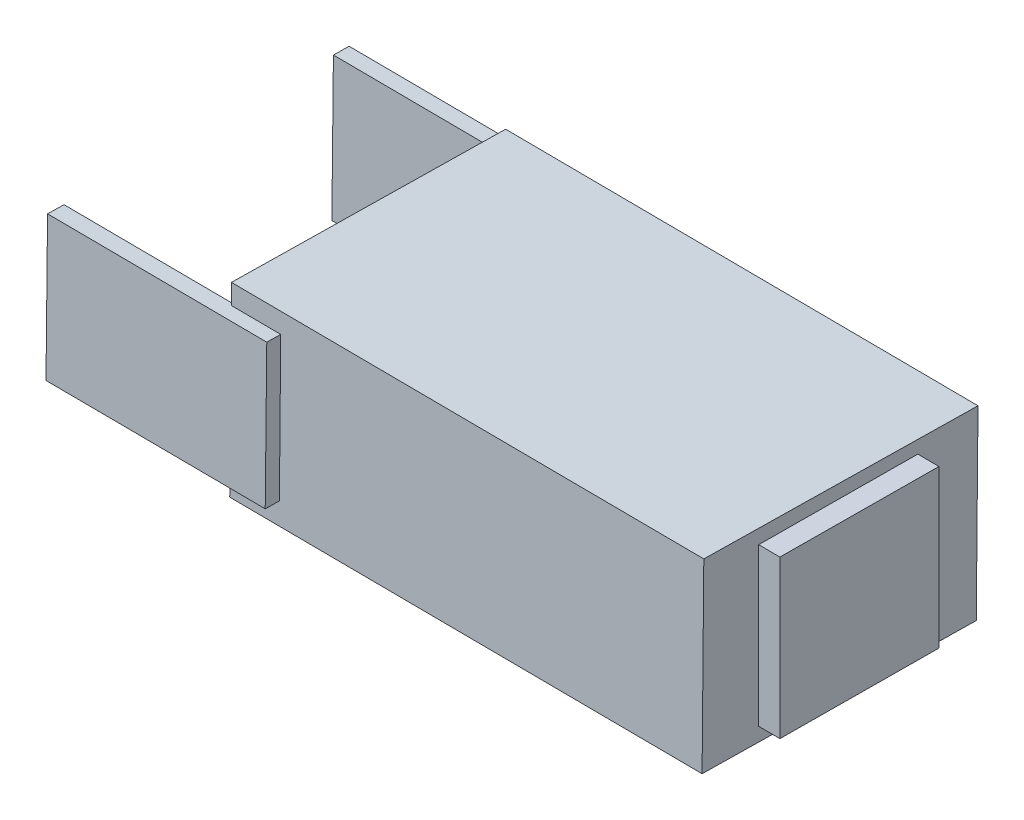
ISO-10303-21;
HEADER;
FILE_DESCRIPTION(('STEP AP214'),'2;1');
FILE_NAME('part.step','',(''),(''),'','','');
FILE_SCHEMA(('AUTOMOTIVE_DESIGN { 1 0 10303 214 1 1 1 1 }'));
ENDSEC;
DATA;
#1=APPLICATION_CONTEXT('core data for automotive mechanical design processes');
#2=APPLICATION_PROTOCOL_DEFINITION('international standard','automotive_design',2000,#1);
#3=PRODUCT_CONTEXT('',#1,'mechanical');
#4=PRODUCT('Part','Part','',(#3));
#5=PRODUCT_RELATED_PRODUCT_CATEGORY('part','',(#4));
#6=PRODUCT_DEFINITION_FORMATION('','',#4);
#7=PRODUCT_DEFINITION_CONTEXT('part definition',#1,'design');
#8=PRODUCT_DEFINITION('design','',#6,#7);
#9=PRODUCT_DEFINITION_SHAPE('','',#8);
#10=(LENGTH_UNIT() NAMED_UNIT(*) SI_UNIT(.MILLI.,.METRE.));
#11=(NAMED_UNIT(*) PLANE_ANGLE_UNIT() SI_UNIT($,.RADIAN.));
#12=(NAMED_UNIT(*) SI_UNIT($,.STERADIAN.) SOLID_ANGLE_UNIT());
#13=UNCERTAINTY_MEASURE_WITH_UNIT(LENGTH_MEASURE(1.E-05),#10,'distance_accuracy_value','');
#14=(GEOMETRIC_REPRESENTATION_CONTEXT(3) GLOBAL_UNCERTAINTY_ASSIGNED_CONTEXT((#13)) GLOBAL_UNIT_ASSIGNED_CONTEXT((#10,
#11,#12)) REPRESENTATION_CONTEXT('',''));
#15=CARTESIAN_POINT('',(0.,0.,0.));
#16=DIRECTION('',(0.,0.,1.));
#17=DIRECTION('',(1.,0.,0.));
#18=AXIS2_PLACEMENT_3D('',#15,#16,#17);
#19=CARTESIAN_POINT('',(270.257448038928,0.0207505591907991,1.91307762517656));
#20=DIRECTION('',(-0.999974943834145,-7.67787878256531E-05,-0.00707854567808517));
#21=DIRECTION('',(-0.00707854569894912,0.,0.999974946781562));
#22=AXIS2_PLACEMENT_3D('',#19,#20,#21);
#23=PLANE('',#22);
#24=DIRECTION('',(1.09657575421331E-05,-0.999956780919569,0.0092971056100546));
#25=VECTOR('',#24,1.);
#26=CARTESIAN_POINT('',(273.771254421079,-237.001225716183,-491.905884429451));
#27=LINE('',#26,#25);
#28=CARTESIAN_POINT('',(273.771254421079,-237.001225716183,-491.905884429451));
#29=VERTEX_POINT('',#28);
#30=CARTESIAN_POINT('',(273.771540444246,-263.083400614204,-491.663385214291));
#31=VERTEX_POINT('',#30);
#32=EDGE_CURVE('E306',#29,#31,#27,.T.);
#33=ORIENTED_EDGE('',*,*,#32,.F.);
#34=DIRECTION('',(0.00707895357034994,-0.00929679503861884,-0.999931726678556));
#35=VECTOR('',#34,1.);
#36=CARTESIAN_POINT('',(273.771254421079,-237.001225716183,-491.905884429451));
#37=LINE('',#36,#35);
#38=CARTESIAN_POINT('',(273.49979153482,-236.644713303854,-453.560619145846));
#39=VERTEX_POINT('',#38);
#40=EDGE_CURVE('E316',#39,#29,#37,.T.);
#41=ORIENTED_EDGE('',*,*,#40,.F.);
#42=DIRECTION('',(-1.09657575431972E-05,0.999956780919569,-0.00929710561005673));
#43=VECTOR('',#42,1.);
#44=CARTESIAN_POINT('',(273.49979153482,-236.644713303854,-453.560619145846));
#45=LINE('',#44,#43);
#46=CARTESIAN_POINT('',(273.500077557988,-262.726888201874,-453.318119930686));
#47=VERTEX_POINT('',#46);
#48=EDGE_CURVE('E313',#47,#39,#45,.T.);
#49=ORIENTED_EDGE('',*,*,#48,.F.);
#50=DIRECTION('',(-0.00707895357034921,0.00929679503861956,0.999931726678556));
#51=VECTOR('',#50,1.);
#52=CARTESIAN_POINT('',(273.771540444246,-263.083400614204,-491.663385214291));
#53=LINE('',#52,#51);
#54=EDGE_CURVE('E309',#31,#47,#53,.T.);
#55=ORIENTED_EDGE('',*,*,#54,.F.);
#56=EDGE_LOOP('',(#33,#41,#49,#55));
#57=FACE_BOUND('',#56,.T.);
#58=DIRECTION('',(7.67807114300989E-05,-0.999999997052361,0.));
#59=VECTOR('',#58,1.);
#60=CARTESIAN_POINT('',(273.535986913891,0.0210022877388938,-461.240922613393));
#61=LINE('',#60,#59);
#62=CARTESIAN_POINT('',(273.554317622219,-238.720055625253,-461.240922613393));
#63=VERTEX_POINT('',#62);
#64=CARTESIAN_POINT('',(273.55601837581,-260.870847851427,-461.240922613393));
#65=VERTEX_POINT('',#64);
#66=EDGE_CURVE('E443',#63,#65,#61,.T.);
#67=ORIENTED_EDGE('',*,*,#66,.F.);
#68=DIRECTION('',(-0.00707854565722093,-5.43495773381844E-07,0.99997494678171));
#69=VECTOR('',#68,1.);
#70=CARTESIAN_POINT('',(270.275778747256,-238.720307353801,1.91307762517668));
#71=LINE('',#70,#69);
#72=CARTESIAN_POINT('',(273.711807606152,-238.72004353306,-483.489283495451));
#73=VERTEX_POINT('',#72);
#74=EDGE_CURVE('E207',#73,#63,#71,.T.);
#75=ORIENTED_EDGE('',*,*,#74,.F.);
#76=DIRECTION('',(7.67807114300988E-05,-0.999999997052361,0.));
#77=VECTOR('',#76,1.);
#78=CARTESIAN_POINT('',(273.693476897824,0.0210143799319305,-483.489283495451));
#79=LINE('',#78,#77);
#80=CARTESIAN_POINT('',(273.713508359743,-260.870835759234,-483.489283495451));
#81=VERTEX_POINT('',#80);
#82=EDGE_CURVE('E203',#73,#81,#79,.T.);
#83=ORIENTED_EDGE('',*,*,#82,.T.);
#84=DIRECTION('',(-0.00707854565722093,-5.43495772134533E-07,0.99997494678171));
#85=VECTOR('',#84,1.);
#86=CARTESIAN_POINT('',(270.277479500847,-260.871099579975,1.913077625177));
#87=LINE('',#86,#85);
#88=EDGE_CURVE('E59',#81,#65,#87,.T.);
#89=ORIENTED_EDGE('',*,*,#88,.T.);
#90=EDGE_LOOP('',(#67,#75,#83,#89));
#91=FACE_BOUND('',#90,.T.);
#92=ADVANCED_FACE('F43',(#57,#91),#23,.F.);
#93=CARTESIAN_POINT('',(203.259126802041,0.0156063804064122,1.43881506474485));
#94=DIRECTION('',(-0.999974943834145,-7.67787878256531E-05,-0.00707854567808517));
#95=DIRECTION('',(-0.00707854569894912,0.,0.999974946781562));
#96=AXIS2_PLACEMENT_3D('',#93,#94,#95);
#97=PLANE('',#96);
#98=DIRECTION('',(-1.09657575431972E-05,0.999956780919569,-0.00929710561005673));
#99=VECTOR('',#98,1.);
#100=CARTESIAN_POINT('',(206.501470297933,-236.649857482638,-454.034881706277));
#101=LINE('',#100,#99);
#102=CARTESIAN_POINT('',(206.5017563211,-262.732032380659,-453.792382491117));
#103=VERTEX_POINT('',#102);
#104=CARTESIAN_POINT('',(206.501722750691,-259.670779310986,-453.820844514308));
#105=VERTEX_POINT('',#104);
#106=EDGE_CURVE('E329',#103,#105,#101,.T.);
#107=ORIENTED_EDGE('',*,*,#106,.T.);
#108=DIRECTION('',(0.00707896206367842,-0.0108457798395198,-0.999916125160393));
#109=VECTOR('',#108,1.);
#110=CARTESIAN_POINT('',(203.259126802043,-254.702751307559,4.20166602699391));
#111=LINE('',#110,#109);
#112=CARTESIAN_POINT('',(206.503965959169,-259.674216163038,-454.137701746992));
#113=VERTEX_POINT('',#112);
#114=EDGE_CURVE('E257',#105,#113,#111,.T.);
#115=ORIENTED_EDGE('',*,*,#114,.T.);
#116=DIRECTION('',(0.,0.99994117985244,-0.0108460515999868));
#117=VECTOR('',#116,1.);
#118=CARTESIAN_POINT('',(206.503965959167,-4.95585847507191,-456.900552709241));
#119=LINE('',#118,#117);
#120=CARTESIAN_POINT('',(206.503965959169,-239.456518158962,-454.356996841747));
#121=VERTEX_POINT('',#120);
#122=EDGE_CURVE('E11',#113,#121,#119,.T.);
#123=ORIENTED_EDGE('',*,*,#122,.T.);
#124=DIRECTION('',(-0.00707896206367842,0.0108457798395198,0.999916125160393));
#125=VECTOR('',#124,1.);
#126=CARTESIAN_POINT('',(203.259126802043,-234.485053303483,3.9823709322389));
#127=LINE('',#126,#125);
#128=CARTESIAN_POINT('',(206.501501035009,-239.452741613118,-454.008821870221));
#129=VERTEX_POINT('',#128);
#130=EDGE_CURVE('E254',#121,#129,#127,.T.);
#131=ORIENTED_EDGE('',*,*,#130,.T.);
#132=CARTESIAN_POINT('',(206.501470297933,-236.649857482638,-454.034881706277));
#133=VERTEX_POINT('',#132);
#134=EDGE_CURVE('E328',#129,#133,#101,.T.);
#135=ORIENTED_EDGE('',*,*,#134,.T.);
#136=DIRECTION('',(0.00707895357034994,-0.00929679503861884,-0.999931726678556));
#137=VECTOR('',#136,1.);
#138=CARTESIAN_POINT('',(206.772933184191,-237.006369894968,-492.380146989883));
#139=LINE('',#138,#137);
#140=CARTESIAN_POINT('',(206.772933184191,-237.006369894968,-492.380146989883));
#141=VERTEX_POINT('',#140);
#142=EDGE_CURVE('E333',#133,#141,#139,.T.);
#143=ORIENTED_EDGE('',*,*,#142,.T.);
#144=DIRECTION('',(1.09657575421331E-05,-0.999956780919569,0.0092971056100546));
#145=VECTOR('',#144,1.);
#146=CARTESIAN_POINT('',(206.772933184191,-237.006369894968,-492.380146989883));
#147=LINE('',#146,#145);
#148=CARTESIAN_POINT('',(206.772965256087,-239.930974921039,-492.352955452895));
#149=VERTEX_POINT('',#148);
#150=EDGE_CURVE('E321',#141,#149,#147,.T.);
#151=ORIENTED_EDGE('',*,*,#150,.T.);
#152=DIRECTION('',(-0.00707896206367842,0.0108457798395198,0.999916125160393));
#153=VECTOR('',#152,1.);
#154=CARTESIAN_POINT('',(203.259126802043,-234.547372364424,3.98304688774933));
#155=LINE('',#154,#153);
#156=CARTESIAN_POINT('',(206.77084282897,-239.927723119853,-492.053158804784));
#157=VERTEX_POINT('',#156);
#158=EDGE_CURVE('E303',#149,#157,#155,.T.);
#159=ORIENTED_EDGE('',*,*,#158,.T.);
#160=DIRECTION('',(0.,-0.99994117985244,0.0108460515999871));
#161=VECTOR('',#160,1.);
#162=CARTESIAN_POINT('',(206.770842828968,-5.36474437502192,-494.597390627788));
#163=LINE('',#162,#161);
#164=CARTESIAN_POINT('',(206.77084282897,-260.007107389949,-491.835363956169));
#165=VERTEX_POINT('',#164);
#166=EDGE_CURVE('E362',#157,#165,#163,.T.);
#167=ORIENTED_EDGE('',*,*,#166,.T.);
#168=DIRECTION('',(0.00707896206367842,-0.0108457798395198,-0.999916125160393));
#169=VECTOR('',#168,1.);
#170=CARTESIAN_POINT('',(203.259126802043,-254.62675663452,4.20084173636391));
#171=LINE('',#170,#169);
#172=CARTESIAN_POINT('',(206.773185454963,-260.010696561007,-492.166264091558));
#173=VERTEX_POINT('',#172);
#174=EDGE_CURVE('E299',#165,#173,#171,.T.);
#175=ORIENTED_EDGE('',*,*,#174,.T.);
#176=CARTESIAN_POINT('',(206.773219207359,-263.088544792989,-492.137647774723));
#177=VERTEX_POINT('',#176);
#178=EDGE_CURVE('E320',#173,#177,#147,.T.);
#179=ORIENTED_EDGE('',*,*,#178,.T.);
#180=DIRECTION('',(-0.00707895357034921,0.00929679503861956,0.999931726678556));
#181=VECTOR('',#180,1.);
#182=CARTESIAN_POINT('',(206.773219207359,-263.088544792989,-492.137647774723));
#183=LINE('',#182,#181);
#184=EDGE_CURVE('E325',#177,#103,#183,.T.);
#185=ORIENTED_EDGE('',*,*,#184,.T.);
#186=EDGE_LOOP('',(#107,#115,#123,#131,#135,#143,#151,#159,#167,#175,#179,#185));
#187=FACE_BOUND('',#186,.T.);
#188=ADVANCED_FACE('F399',(#187),#97,.T.);
#189=CARTESIAN_POINT('',(206.501470297933,-236.649857482638,-454.034881706277));
#190=DIRECTION('',(0.00707895357034935,-0.00929679503862093,-0.999931726678556));
#191=DIRECTION('',(0.,0.999956781701404,-0.00929702798593712));
#192=AXIS2_PLACEMENT_3D('',#189,#190,#191);
#193=PLANE('',#192);
#194=ORIENTED_EDGE('',*,*,#48,.T.);
#195=DIRECTION('',(0.999974943834145,7.67787878266708E-05,0.00707854567808531));
#196=VECTOR('',#195,1.);
#197=CARTESIAN_POINT('',(206.501470297933,-236.649857482638,-454.034881706277));
#198=LINE('',#197,#196);
#199=EDGE_CURVE('E339',#133,#39,#198,.T.);
#200=ORIENTED_EDGE('',*,*,#199,.F.);
#201=ORIENTED_EDGE('',*,*,#134,.F.);
#202=DIRECTION('',(-0.999974943834145,-7.67787878176183E-05,-0.00707854567808539));
#203=VECTOR('',#202,1.);
#204=CARTESIAN_POINT('',(206.501501035009,-239.452741613118,-454.008821870221));
#205=LINE('',#204,#203);
#206=CARTESIAN_POINT('',(213.516372606478,-239.452203006287,-453.959165537179));
#207=VERTEX_POINT('',#206);
#208=EDGE_CURVE('E365',#207,#129,#205,.T.);
#209=ORIENTED_EDGE('',*,*,#208,.F.);
#210=DIRECTION('',(-1.09657575334693E-05,0.999956780919569,-0.00929710561005666));
#211=VECTOR('',#210,1.);
#212=CARTESIAN_POINT('',(213.516341869401,-236.649318875807,-453.985225373235));
#213=LINE('',#212,#211);
#214=CARTESIAN_POINT('',(213.516594322159,-259.670240704155,-453.771188181266));
#215=VERTEX_POINT('',#214);
#216=EDGE_CURVE('E369',#215,#207,#213,.T.);
#217=ORIENTED_EDGE('',*,*,#216,.F.);
#218=DIRECTION('',(0.999974943834145,7.67787878158332E-05,0.00707854567808541));
#219=VECTOR('',#218,1.);
#220=CARTESIAN_POINT('',(206.50172275069,-259.670779310986,-453.820844514308));
#221=LINE('',#220,#219);
#222=EDGE_CURVE('E52',#105,#215,#221,.T.);
#223=ORIENTED_EDGE('',*,*,#222,.F.);
#224=ORIENTED_EDGE('',*,*,#106,.F.);
#225=DIRECTION('',(0.999974943834145,7.67787878266708E-05,0.00707854567808531));
#226=VECTOR('',#225,1.);
#227=CARTESIAN_POINT('',(206.5017563211,-262.732032380659,-453.792382491117));
#228=LINE('',#227,#226);
#229=EDGE_CURVE('E343',#103,#47,#228,.T.);
#230=ORIENTED_EDGE('',*,*,#229,.T.);
#231=EDGE_LOOP('',(#194,#200,#201,#209,#217,#223,#224,#230));
#232=FACE_BOUND('',#231,.T.);
#233=ADVANCED_FACE('F404',(#232),#193,.F.);
#234=CARTESIAN_POINT('',(206.772933184191,-237.006369894968,-492.380146989883));
#235=DIRECTION('',(-0.00707895357034935,0.0092967950386188,0.999931726678556));
#236=DIRECTION('',(0.,-0.999956781701404,0.00929702798593499));
#237=AXIS2_PLACEMENT_3D('',#234,#235,#236);
#238=PLANE('',#237);
#239=ORIENTED_EDGE('',*,*,#32,.T.);
#240=DIRECTION('',(0.999974943834145,7.67787878266708E-05,0.00707854567808531));
#241=VECTOR('',#240,1.);
#242=CARTESIAN_POINT('',(206.773219207359,-263.088544792989,-492.137647774723));
#243=LINE('',#242,#241);
#244=EDGE_CURVE('E346',#177,#31,#243,.T.);
#245=ORIENTED_EDGE('',*,*,#244,.F.);
#246=ORIENTED_EDGE('',*,*,#178,.F.);
#247=DIRECTION('',(-0.999974943834145,-7.67787878162537E-05,-0.0070785456780854));
#248=VECTOR('',#247,1.);
#249=CARTESIAN_POINT('',(206.773185454962,-260.010696561007,-492.166264091558));
#250=LINE('',#249,#248);
#251=CARTESIAN_POINT('',(213.914120008543,-260.010148274971,-492.11571539358));
#252=VERTEX_POINT('',#251);
#253=EDGE_CURVE('E350',#252,#173,#250,.T.);
#254=ORIENTED_EDGE('',*,*,#253,.F.);
#255=DIRECTION('',(1.09657575334865E-05,-0.99995678091957,0.00929710561005454));
#256=VECTOR('',#255,1.);
#257=CARTESIAN_POINT('',(213.913867737772,-237.005821608931,-492.329598291905));
#258=LINE('',#257,#256);
#259=CARTESIAN_POINT('',(213.913899809668,-239.930426635003,-492.302406754916));
#260=VERTEX_POINT('',#259);
#261=EDGE_CURVE('E354',#260,#252,#258,.T.);
#262=ORIENTED_EDGE('',*,*,#261,.F.);
#263=DIRECTION('',(0.999974943834145,7.67787878171227E-05,0.00707854567808539));
#264=VECTOR('',#263,1.);
#265=CARTESIAN_POINT('',(206.772965256087,-239.930974921039,-492.352955452895));
#266=LINE('',#265,#264);
#267=EDGE_CURVE('E358',#149,#260,#266,.T.);
#268=ORIENTED_EDGE('',*,*,#267,.F.);
#269=ORIENTED_EDGE('',*,*,#150,.F.);
#270=DIRECTION('',(0.999974943834145,7.67787878266708E-05,0.00707854567808531));
#271=VECTOR('',#270,1.);
#272=CARTESIAN_POINT('',(206.772933184191,-237.006369894968,-492.380146989883));
#273=LINE('',#272,#271);
#274=EDGE_CURVE('E336',#141,#29,#273,.T.);
#275=ORIENTED_EDGE('',*,*,#274,.T.);
#276=EDGE_LOOP('',(#239,#245,#246,#254,#262,#268,#269,#275));
#277=FACE_BOUND('',#276,.T.);
#278=ADVANCED_FACE('F45',(#277),#238,.F.);
#279=CARTESIAN_POINT('',(206.773219207359,-263.088544792989,-492.137647774723));
#280=DIRECTION('',(-1.0965757543144E-05,0.999956780919569,-0.00929710561005536));
#281=DIRECTION('',(0.,0.00929710561061434,0.999956780979691));
#282=AXIS2_PLACEMENT_3D('',#279,#280,#281);
#283=PLANE('',#282);
#284=ORIENTED_EDGE('',*,*,#244,.T.);
#285=ORIENTED_EDGE('',*,*,#54,.T.);
#286=ORIENTED_EDGE('',*,*,#229,.F.);
#287=ORIENTED_EDGE('',*,*,#184,.F.);
#288=EDGE_LOOP('',(#284,#285,#286,#287));
#289=FACE_BOUND('',#288,.T.);
#290=ADVANCED_FACE('F437',(#289),#283,.F.);
#291=CARTESIAN_POINT('',(206.772933184191,-237.006369894968,-492.380146989883));
#292=DIRECTION('',(1.09657575431491E-05,-0.999956780919569,0.00929710561005465));
#293=DIRECTION('',(0.,-0.00929710561061363,-0.999956780979691));
#294=AXIS2_PLACEMENT_3D('',#291,#292,#293);
#295=PLANE('',#294);
#296=ORIENTED_EDGE('',*,*,#199,.T.);
#297=ORIENTED_EDGE('',*,*,#40,.T.);
#298=ORIENTED_EDGE('',*,*,#274,.F.);
#299=ORIENTED_EDGE('',*,*,#142,.F.);
#300=EDGE_LOOP('',(#296,#297,#298,#299));
#301=FACE_BOUND('',#300,.T.);
#302=ADVANCED_FACE('F408',(#301),#295,.F.);
#303=CARTESIAN_POINT('',(213.927351099091,-239.951035549463,-494.202425582158));
#304=DIRECTION('',(-0.999974943834145,-7.67787878170082E-05,-0.00707854567808541));
#305=DIRECTION('',(-0.00707854569894936,0.,0.999974946781562));
#306=AXIS2_PLACEMENT_3D('',#303,#304,#305);
#307=PLANE('',#306);
#308=DIRECTION('',(-0.00707896206367857,0.0108457798395198,0.999916125160393));
#309=VECTOR('',#308,1.);
#310=CARTESIAN_POINT('',(213.927351099091,-239.951035549463,-494.202425582158));
#311=LINE('',#310,#309);
#312=CARTESIAN_POINT('',(213.927351099091,-239.951035549463,-494.202425582158));
#313=VERTEX_POINT('',#312);
#314=EDGE_CURVE('E295',#313,#260,#311,.T.);
#315=ORIENTED_EDGE('',*,*,#314,.T.);
#316=ORIENTED_EDGE('',*,*,#261,.T.);
#317=DIRECTION('',(-0.00707896206367857,0.0108457798395198,0.999916125160393));
#318=VECTOR('',#317,1.);
#319=CARTESIAN_POINT('',(213.927351099091,-260.030419819559,-493.984630733543));
#320=LINE('',#319,#318);
#321=CARTESIAN_POINT('',(213.927351099091,-260.030419819559,-493.984630733543));
#322=VERTEX_POINT('',#321);
#323=EDGE_CURVE('E291',#322,#252,#320,.T.);
#324=ORIENTED_EDGE('',*,*,#323,.F.);
#325=DIRECTION('',(0.,-0.99994117985244,0.010846051599987));
#326=VECTOR('',#325,1.);
#327=CARTESIAN_POINT('',(213.927351099091,-239.951035549463,-494.202425582158));
#328=LINE('',#327,#326);
#329=EDGE_CURVE('E275',#313,#322,#328,.T.);
#330=ORIENTED_EDGE('',*,*,#329,.F.);
#331=EDGE_LOOP('',(#315,#316,#324,#330));
#332=FACE_BOUND('',#331,.T.);
#333=ADVANCED_FACE('F497',(#332),#307,.F.);
#334=CARTESIAN_POINT('',(182.686975578581,-239.953434207728,-494.42356754825));
#335=DIRECTION('',(0.,-0.99994117985244,0.0108460515999875));
#336=DIRECTION('',(0.,-0.0108460515999875,-0.99994117985244));
#337=AXIS2_PLACEMENT_3D('',#334,#335,#336);
#338=PLANE('',#337);
#339=ORIENTED_EDGE('',*,*,#158,.F.);
#340=ORIENTED_EDGE('',*,*,#267,.T.);
#341=ORIENTED_EDGE('',*,*,#314,.F.);
#342=DIRECTION('',(0.999974943834145,7.67787878171403E-05,0.00707854567808701));
#343=VECTOR('',#342,1.);
#344=CARTESIAN_POINT('',(182.686975578581,-239.953434207728,-494.42356754825));
#345=LINE('',#344,#343);
#346=CARTESIAN_POINT('',(182.686975578581,-239.953434207728,-494.42356754825));
#347=VERTEX_POINT('',#346);
#348=EDGE_CURVE('E271',#347,#313,#345,.T.);
#349=ORIENTED_EDGE('',*,*,#348,.F.);
#350=DIRECTION('',(-0.00707896206367857,0.0108457798395198,0.999916125160393));
#351=VECTOR('',#350,1.);
#352=CARTESIAN_POINT('',(182.686975578581,-239.953434207728,-494.42356754825));
#353=LINE('',#352,#351);
#354=CARTESIAN_POINT('',(182.671401862041,-239.929573492081,-492.223752072897));
#355=VERTEX_POINT('',#354);
#356=EDGE_CURVE('E284',#347,#355,#353,.T.);
#357=ORIENTED_EDGE('',*,*,#356,.T.);
#358=DIRECTION('',(0.999974943834145,7.67787878171403E-05,0.00707854567808701));
#359=VECTOR('',#358,1.);
#360=CARTESIAN_POINT('',(182.671401862041,-239.929573492081,-492.223752072897));
#361=LINE('',#360,#359);
#362=EDGE_CURVE('E260',#355,#157,#361,.T.);
#363=ORIENTED_EDGE('',*,*,#362,.T.);
#364=EDGE_LOOP('',(#339,#340,#341,#349,#357,#363));
#365=FACE_BOUND('',#364,.T.);
#366=ADVANCED_FACE('F415',(#365),#338,.F.);
#367=CARTESIAN_POINT('',(182.686975578581,-260.032818477824,-494.205772699636));
#368=DIRECTION('',(0.,0.99994117985244,-0.0108460515999875));
#369=DIRECTION('',(0.,0.0108460515999875,0.99994117985244));
#370=AXIS2_PLACEMENT_3D('',#367,#368,#369);
#371=PLANE('',#370);
#372=ORIENTED_EDGE('',*,*,#174,.F.);
#373=DIRECTION('',(-0.999974943834145,-7.67787878162519E-05,-0.00707854567808524));
#374=VECTOR('',#373,1.);
#375=CARTESIAN_POINT('',(182.671401862041,-260.008957762177,-492.005957224283));
#376=LINE('',#375,#374);
#377=CARTESIAN_POINT('',(182.671401862041,-260.008957762177,-492.005957224283));
#378=VERTEX_POINT('',#377);
#379=EDGE_CURVE('E264',#165,#378,#376,.T.);
#380=ORIENTED_EDGE('',*,*,#379,.T.);
#381=DIRECTION('',(-0.00707896206367857,0.0108457798395198,0.999916125160393));
#382=VECTOR('',#381,1.);
#383=CARTESIAN_POINT('',(182.686975578581,-260.032818477824,-494.205772699636));
#384=LINE('',#383,#382);
#385=CARTESIAN_POINT('',(182.686975578581,-260.032818477824,-494.205772699636));
#386=VERTEX_POINT('',#385);
#387=EDGE_CURVE('E287',#386,#378,#384,.T.);
#388=ORIENTED_EDGE('',*,*,#387,.F.);
#389=DIRECTION('',(-0.999974943834145,-7.67787878162519E-05,-0.00707854567808524));
#390=VECTOR('',#389,1.);
#391=CARTESIAN_POINT('',(182.686975578581,-260.032818477824,-494.205772699636));
#392=LINE('',#391,#390);
#393=EDGE_CURVE('E278',#322,#386,#392,.T.);
#394=ORIENTED_EDGE('',*,*,#393,.F.);
#395=ORIENTED_EDGE('',*,*,#323,.T.);
#396=ORIENTED_EDGE('',*,*,#253,.T.);
#397=EDGE_LOOP('',(#372,#380,#388,#394,#395,#396));
#398=FACE_BOUND('',#397,.T.);
#399=ADVANCED_FACE('F431',(#398),#371,.F.);
#400=CARTESIAN_POINT('',(182.686975578581,-239.953434207728,-494.42356754825));
#401=DIRECTION('',(0.999974943834145,7.67787878170278E-05,0.00707854567808541));
#402=DIRECTION('',(0.00707854569894936,0.,-0.999974946781562));
#403=AXIS2_PLACEMENT_3D('',#400,#401,#402);
#404=PLANE('',#403);
#405=ORIENTED_EDGE('',*,*,#387,.T.);
#406=DIRECTION('',(0.,0.99994117985244,-0.0108460515999898));
#407=VECTOR('',#406,1.);
#408=CARTESIAN_POINT('',(182.671401862041,-239.929573492081,-492.223752072897));
#409=LINE('',#408,#407);
#410=EDGE_CURVE('E267',#378,#355,#409,.T.);
#411=ORIENTED_EDGE('',*,*,#410,.T.);
#412=ORIENTED_EDGE('',*,*,#356,.F.);
#413=DIRECTION('',(0.,0.99994117985244,-0.0108460515999898));
#414=VECTOR('',#413,1.);
#415=CARTESIAN_POINT('',(182.686975578581,-239.953434207728,-494.42356754825));
#416=LINE('',#415,#414);
#417=EDGE_CURVE('E281',#386,#347,#416,.T.);
#418=ORIENTED_EDGE('',*,*,#417,.F.);
#419=EDGE_LOOP('',(#405,#411,#412,#418));
#420=FACE_BOUND('',#419,.T.);
#421=ADVANCED_FACE('F425',(#420),#404,.F.);
#422=CARTESIAN_POINT('',(3.5272897434679,-5.40421147107528,-498.236021167886));
#423=DIRECTION('',(0.00707896206368017,-0.0108457798395192,-0.999916125160393));
#424=DIRECTION('',(0.,0.99994117985244,-0.010846051599987));
#425=AXIS2_PLACEMENT_3D('',#422,#423,#424);
#426=PLANE('',#425);
#427=ORIENTED_EDGE('',*,*,#348,.T.);
#428=ORIENTED_EDGE('',*,*,#329,.T.);
#429=ORIENTED_EDGE('',*,*,#393,.T.);
#430=ORIENTED_EDGE('',*,*,#417,.T.);
#431=EDGE_LOOP('',(#427,#428,#429,#430));
#432=FACE_BOUND('',#431,.T.);
#433=ADVANCED_FACE('F489',(#432),#426,.T.);
#434=CARTESIAN_POINT('',(3.51171602692781,-5.38035075542833,-496.036205692533));
#435=DIRECTION('',(0.00707896206368017,-0.0108457798395192,-0.999916125160393));
#436=DIRECTION('',(0.,0.99994117985244,-0.010846051599987));
#437=AXIS2_PLACEMENT_3D('',#434,#435,#436);
#438=PLANE('',#437);
#439=ORIENTED_EDGE('',*,*,#166,.F.);
#440=ORIENTED_EDGE('',*,*,#362,.F.);
#441=ORIENTED_EDGE('',*,*,#410,.F.);
#442=ORIENTED_EDGE('',*,*,#379,.F.);
#443=EDGE_LOOP('',(#439,#440,#441,#442));
#444=FACE_BOUND('',#443,.T.);
#445=ADVANCED_FACE('F422',(#444),#438,.F.);
#446=CARTESIAN_POINT('',(213.502555917891,-259.648732262576,-451.788238326081));
#447=DIRECTION('',(-0.999974943834145,-7.67787878170061E-05,-0.00707854567808541));
#448=DIRECTION('',(-0.00707854569894936,0.,0.999974946781562));
#449=AXIS2_PLACEMENT_3D('',#446,#447,#448);
#450=PLANE('',#449);
#451=DIRECTION('',(0.00707896206367857,-0.0108457798395198,-0.999916125160393));
#452=VECTOR('',#451,1.);
#453=CARTESIAN_POINT('',(213.502555917891,-259.648732262576,-451.788238326081));
#454=LINE('',#453,#452);
#455=CARTESIAN_POINT('',(213.502555917891,-259.648732262576,-451.788238326081));
#456=VERTEX_POINT('',#455);
#457=EDGE_CURVE('E250',#456,#215,#454,.T.);
#458=ORIENTED_EDGE('',*,*,#457,.T.);
#459=ORIENTED_EDGE('',*,*,#216,.T.);
#460=DIRECTION('',(0.00707896206367857,-0.0108457798395198,-0.999916125160393));
#461=VECTOR('',#460,1.);
#462=CARTESIAN_POINT('',(213.502555917891,-239.4310342585,-452.007533420836));
#463=LINE('',#462,#461);
#464=CARTESIAN_POINT('',(213.502555917891,-239.4310342585,-452.007533420836));
#465=VERTEX_POINT('',#464);
#466=EDGE_CURVE('E246',#465,#207,#463,.T.);
#467=ORIENTED_EDGE('',*,*,#466,.F.);
#468=DIRECTION('',(0.,0.99994117985244,-0.0108460515999867));
#469=VECTOR('',#468,1.);
#470=CARTESIAN_POINT('',(213.502555917891,-259.648732262576,-451.788238326081));
#471=LINE('',#470,#469);
#472=EDGE_CURVE('E230',#456,#465,#471,.T.);
#473=ORIENTED_EDGE('',*,*,#472,.F.);
#474=EDGE_LOOP('',(#458,#459,#467,#473));
#475=FACE_BOUND('',#474,.T.);
#476=ADVANCED_FACE('F382',(#475),#450,.F.);
#477=CARTESIAN_POINT('',(182.408831002215,-259.651119660903,-452.008342193158));
#478=DIRECTION('',(0.,0.99994117985244,-0.0108460515999875));
#479=DIRECTION('',(0.,0.0108460515999875,0.99994117985244));
#480=AXIS2_PLACEMENT_3D('',#477,#478,#479);
#481=PLANE('',#480);
#482=ORIENTED_EDGE('',*,*,#114,.F.);
#483=ORIENTED_EDGE('',*,*,#222,.T.);
#484=ORIENTED_EDGE('',*,*,#457,.F.);
#485=DIRECTION('',(0.999974943834145,7.67787878158338E-05,0.00707854567808547));
#486=VECTOR('',#485,1.);
#487=CARTESIAN_POINT('',(182.408831002215,-259.651119660903,-452.008342193158));
#488=LINE('',#487,#486);
#489=CARTESIAN_POINT('',(182.408831002215,-259.651119660903,-452.008342193158));
#490=VERTEX_POINT('',#489);
#491=EDGE_CURVE('E226',#490,#456,#488,.T.);
#492=ORIENTED_EDGE('',*,*,#491,.F.);
#493=DIRECTION('',(0.00707896206367857,-0.0108457798395198,-0.999916125160393));
#494=VECTOR('',#493,1.);
#495=CARTESIAN_POINT('',(182.408831002215,-259.651119660903,-452.008342193158));
#496=LINE('',#495,#494);
#497=CARTESIAN_POINT('',(182.425112614961,-259.676064954533,-454.308149281027));
#498=VERTEX_POINT('',#497);
#499=EDGE_CURVE('E239',#490,#498,#496,.T.);
#500=ORIENTED_EDGE('',*,*,#499,.T.);
#501=DIRECTION('',(0.999974943834145,7.67787878158338E-05,0.00707854567808547));
#502=VECTOR('',#501,1.);
#503=CARTESIAN_POINT('',(182.425112614961,-259.676064954533,-454.308149281027));
#504=LINE('',#503,#502);
#505=EDGE_CURVE('E209',#498,#113,#504,.T.);
#506=ORIENTED_EDGE('',*,*,#505,.T.);
#507=EDGE_LOOP('',(#482,#483,#484,#492,#500,#506));
#508=FACE_BOUND('',#507,.T.);
#509=ADVANCED_FACE('F377',(#508),#481,.F.);
#510=CARTESIAN_POINT('',(182.408831002215,-239.433421656826,-452.227637287913));
#511=DIRECTION('',(0.,-0.99994117985244,0.0108460515999876));
#512=DIRECTION('',(0.,-0.0108460515999876,-0.99994117985244));
#513=AXIS2_PLACEMENT_3D('',#510,#511,#512);
#514=PLANE('',#513);
#515=ORIENTED_EDGE('',*,*,#130,.F.);
#516=DIRECTION('',(-0.999974943834145,-7.67787878176191E-05,-0.00707854567808547));
#517=VECTOR('',#516,1.);
#518=CARTESIAN_POINT('',(182.425112614961,-239.458366950457,-454.527444375782));
#519=LINE('',#518,#517);
#520=CARTESIAN_POINT('',(182.425112614961,-239.458366950457,-454.527444375782));
#521=VERTEX_POINT('',#520);
#522=EDGE_CURVE('E214',#121,#521,#519,.T.);
#523=ORIENTED_EDGE('',*,*,#522,.T.);
#524=DIRECTION('',(0.00707896206367857,-0.0108457798395198,-0.999916125160393));
#525=VECTOR('',#524,1.);
#526=CARTESIAN_POINT('',(182.408831002215,-239.433421656826,-452.227637287913));
#527=LINE('',#526,#525);
#528=CARTESIAN_POINT('',(182.408831002215,-239.433421656826,-452.227637287913));
#529=VERTEX_POINT('',#528);
#530=EDGE_CURVE('E242',#529,#521,#527,.T.);
#531=ORIENTED_EDGE('',*,*,#530,.F.);
#532=DIRECTION('',(-0.999974943834145,-7.67787878176191E-05,-0.00707854567808547));
#533=VECTOR('',#532,1.);
#534=CARTESIAN_POINT('',(182.408831002215,-239.433421656826,-452.227637287913));
#535=LINE('',#534,#533);
#536=EDGE_CURVE('E233',#465,#529,#535,.T.);
#537=ORIENTED_EDGE('',*,*,#536,.F.);
#538=ORIENTED_EDGE('',*,*,#466,.T.);
#539=ORIENTED_EDGE('',*,*,#208,.T.);
#540=EDGE_LOOP('',(#515,#523,#531,#537,#538,#539));
#541=FACE_BOUND('',#540,.T.);
#542=ADVANCED_FACE('F398',(#541),#514,.F.);
#543=CARTESIAN_POINT('',(182.408831002215,-259.651119660903,-452.008342193158));
#544=DIRECTION('',(0.999974943834145,7.67787878170063E-05,0.00707854567808541));
#545=DIRECTION('',(0.00707854569894936,0.,-0.999974946781562));
#546=AXIS2_PLACEMENT_3D('',#543,#544,#545);
#547=PLANE('',#546);
#548=ORIENTED_EDGE('',*,*,#530,.T.);
#549=DIRECTION('',(0.,-0.99994117985244,0.0108460515999867));
#550=VECTOR('',#549,1.);
#551=CARTESIAN_POINT('',(182.425112614961,-259.676064954533,-454.308149281027));
#552=LINE('',#551,#550);
#553=EDGE_CURVE('E222',#521,#498,#552,.T.);
#554=ORIENTED_EDGE('',*,*,#553,.T.);
#555=ORIENTED_EDGE('',*,*,#499,.F.);
#556=DIRECTION('',(0.,-0.99994117985244,0.0108460515999867));
#557=VECTOR('',#556,1.);
#558=CARTESIAN_POINT('',(182.408831002215,-259.651119660903,-452.008342193158));
#559=LINE('',#558,#557);
#560=EDGE_CURVE('E236',#529,#490,#559,.T.);
#561=ORIENTED_EDGE('',*,*,#560,.F.);
#562=EDGE_LOOP('',(#548,#554,#555,#561));
#563=FACE_BOUND('',#562,.T.);
#564=ADVANCED_FACE('F395',(#563),#547,.F.);
#565=CARTESIAN_POINT('',(3.22855754437988,-4.94651956184743,-456.039560686117));
#566=DIRECTION('',(-0.00707896206367861,0.0108457798395189,0.999916125160393));
#567=DIRECTION('',(0.,-0.99994117985244,0.0108460515999867));
#568=AXIS2_PLACEMENT_3D('',#565,#566,#567);
#569=PLANE('',#568);
#570=ORIENTED_EDGE('',*,*,#491,.T.);
#571=ORIENTED_EDGE('',*,*,#472,.T.);
#572=ORIENTED_EDGE('',*,*,#536,.T.);
#573=ORIENTED_EDGE('',*,*,#560,.T.);
#574=EDGE_LOOP('',(#570,#571,#572,#573));
#575=FACE_BOUND('',#574,.T.);
#576=ADVANCED_FACE('F386',(#575),#569,.T.);
#577=CARTESIAN_POINT('',(3.24483915712634,-4.97146485547832,-458.339367773986));
#578=DIRECTION('',(-0.00707896206367861,0.0108457798395189,0.999916125160393));
#579=DIRECTION('',(0.,-0.99994117985244,0.0108460515999867));
#580=AXIS2_PLACEMENT_3D('',#577,#578,#579);
#581=PLANE('',#580);
#582=ORIENTED_EDGE('',*,*,#122,.F.);
#583=ORIENTED_EDGE('',*,*,#505,.F.);
#584=ORIENTED_EDGE('',*,*,#553,.F.);
#585=ORIENTED_EDGE('',*,*,#522,.F.);
#586=EDGE_LOOP('',(#582,#583,#584,#585));
#587=FACE_BOUND('',#586,.T.);
#588=ADVANCED_FACE('F393',(#587),#581,.F.);
#589=CARTESIAN_POINT('',(273.275703578759,-238.720077017438,1.93431326221093));
#590=DIRECTION('',(7.67807114295794E-05,-0.999999997052361,0.));
#591=DIRECTION('',(0.999999997052361,7.67807114295794E-05,0.));
#592=AXIS2_PLACEMENT_3D('',#589,#590,#591);
#593=PLANE('',#592);
#594=ORIENTED_EDGE('',*,*,#74,.T.);
#595=DIRECTION('',(-0.999974943834145,-7.67787878256531E-05,-0.00707854567808517));
#596=VECTOR('',#595,1.);
#597=CARTESIAN_POINT('',(276.554242453722,-238.719825288889,-461.219686976359));
#598=LINE('',#597,#596);
#599=CARTESIAN_POINT('',(276.554242453722,-238.719825288889,-461.219686976359));
#600=VERTEX_POINT('',#599);
#601=EDGE_CURVE('E185',#600,#63,#598,.T.);
#602=ORIENTED_EDGE('',*,*,#601,.F.);
#603=DIRECTION('',(-0.00707854565722093,-5.43495773381844E-07,0.99997494678171));
#604=VECTOR('',#603,1.);
#605=CARTESIAN_POINT('',(273.275703578759,-238.720077017438,1.93431326221093));
#606=LINE('',#605,#604);
#607=CARTESIAN_POINT('',(276.711732437655,-238.719813196696,-483.468047858417));
#608=VERTEX_POINT('',#607);
#609=EDGE_CURVE('E193',#608,#600,#606,.T.);
#610=ORIENTED_EDGE('',*,*,#609,.F.);
#611=DIRECTION('',(-0.999974943834145,-7.67787878256531E-05,-0.00707854567808517));
#612=VECTOR('',#611,1.);
#613=CARTESIAN_POINT('',(276.711732437655,-238.719813196696,-483.468047858417));
#614=LINE('',#613,#612);
#615=EDGE_CURVE('E455',#608,#73,#614,.T.);
#616=ORIENTED_EDGE('',*,*,#615,.T.);
#617=EDGE_LOOP('',(#594,#602,#610,#616));
#618=FACE_BOUND('',#617,.T.);
#619=ADVANCED_FACE('F205',(#618),#593,.F.);
#620=CARTESIAN_POINT('',(276.535911745394,0.0212326241023708,-461.219686976359));
#621=DIRECTION('',(0.00707854565722018,5.43495773062172E-07,-0.99997494678171));
#622=DIRECTION('',(-0.999974946781857,0.,-0.00707854565722122));
#623=AXIS2_PLACEMENT_3D('',#620,#621,#622);
#624=PLANE('',#623);
#625=ORIENTED_EDGE('',*,*,#66,.T.);
#626=DIRECTION('',(-0.999974943834145,-7.67787878256531E-05,-0.00707854567808517));
#627=VECTOR('',#626,1.);
#628=CARTESIAN_POINT('',(276.555943207313,-260.870617515064,-461.219686976359));
#629=LINE('',#628,#627);
#630=CARTESIAN_POINT('',(276.555943207313,-260.870617515064,-461.219686976359));
#631=VERTEX_POINT('',#630);
#632=EDGE_CURVE('E187',#631,#65,#629,.T.);
#633=ORIENTED_EDGE('',*,*,#632,.F.);
#634=DIRECTION('',(7.67807114300989E-05,-0.999999997052361,0.));
#635=VECTOR('',#634,1.);
#636=CARTESIAN_POINT('',(276.535911745394,0.0212326241023708,-461.219686976359));
#637=LINE('',#636,#635);
#638=EDGE_CURVE('E180',#600,#631,#637,.T.);
#639=ORIENTED_EDGE('',*,*,#638,.F.);
#640=ORIENTED_EDGE('',*,*,#601,.T.);
#641=EDGE_LOOP('',(#625,#633,#639,#640));
#642=FACE_BOUND('',#641,.T.);
#643=ADVANCED_FACE('F183',(#642),#624,.F.);
#644=CARTESIAN_POINT('',(273.277404332349,-260.870869243611,1.93431326221125));
#645=DIRECTION('',(7.67807114295706E-05,-0.999999997052361,0.));
#646=DIRECTION('',(0.999999997052361,7.67807114295706E-05,0.));
#647=AXIS2_PLACEMENT_3D('',#644,#645,#646);
#648=PLANE('',#647);
#649=ORIENTED_EDGE('',*,*,#88,.F.);
#650=DIRECTION('',(-0.999974943834145,-7.67787878256531E-05,-0.00707854567808517));
#651=VECTOR('',#650,1.);
#652=CARTESIAN_POINT('',(276.713433191246,-260.870605422871,-483.468047858417));
#653=LINE('',#652,#651);
#654=CARTESIAN_POINT('',(276.713433191246,-260.870605422871,-483.468047858417));
#655=VERTEX_POINT('',#654);
#656=EDGE_CURVE('E216',#655,#81,#653,.T.);
#657=ORIENTED_EDGE('',*,*,#656,.F.);
#658=DIRECTION('',(-0.00707854565722093,-5.43495772134533E-07,0.99997494678171));
#659=VECTOR('',#658,1.);
#660=CARTESIAN_POINT('',(273.277404332349,-260.870869243611,1.93431326221125));
#661=LINE('',#660,#659);
#662=EDGE_CURVE('E192',#655,#631,#661,.T.);
#663=ORIENTED_EDGE('',*,*,#662,.T.);
#664=ORIENTED_EDGE('',*,*,#632,.T.);
#665=EDGE_LOOP('',(#649,#657,#663,#664));
#666=FACE_BOUND('',#665,.T.);
#667=ADVANCED_FACE('F460',(#666),#648,.T.);
#668=CARTESIAN_POINT('',(276.693401729327,0.0212447162954075,-483.468047858417));
#669=DIRECTION('',(0.00707854565722018,5.43495773044432E-07,-0.99997494678171));
#670=DIRECTION('',(-0.999974946781857,0.,-0.00707854565722122));
#671=AXIS2_PLACEMENT_3D('',#668,#669,#670);
#672=PLANE('',#671);
#673=ORIENTED_EDGE('',*,*,#82,.F.);
#674=ORIENTED_EDGE('',*,*,#615,.F.);
#675=DIRECTION('',(7.67807114300988E-05,-0.999999997052361,0.));
#676=VECTOR('',#675,1.);
#677=CARTESIAN_POINT('',(276.693401729327,0.0212447162954075,-483.468047858417));
#678=LINE('',#677,#676);
#679=EDGE_CURVE('E199',#608,#655,#678,.T.);
#680=ORIENTED_EDGE('',*,*,#679,.T.);
#681=ORIENTED_EDGE('',*,*,#656,.T.);
#682=EDGE_LOOP('',(#673,#674,#680,#681));
#683=FACE_BOUND('',#682,.T.);
#684=ADVANCED_FACE('F459',(#683),#672,.T.);
#685=CARTESIAN_POINT('',(276.634185117207,-249.795215329214,-472.392929187001));
#686=DIRECTION('',(-0.999974943834145,-7.67787878282937E-05,-0.00707854567808835));
#687=DIRECTION('',(-0.00707896206368163,0.0108457798394951,0.999916125160393));
#688=AXIS2_PLACEMENT_3D('',#685,#686,#687);
#689=PLANE('',#688);
#690=ORIENTED_EDGE('',*,*,#609,.T.);
#691=ORIENTED_EDGE('',*,*,#638,.T.);
#692=ORIENTED_EDGE('',*,*,#662,.F.);
#693=ORIENTED_EDGE('',*,*,#679,.F.);
#694=EDGE_LOOP('',(#690,#691,#692,#693));
#695=FACE_BOUND('',#694,.T.);
#696=ADVANCED_FACE('F197',(#695),#689,.F.);
#697=CLOSED_SHELL('',(#92,#188,#233,#278,#290,#302,#333,#366,#399,#421,#433,#445,#476,#509,#542,
#564,#576,#588,#619,#643,#667,#684,#696));
#698=MANIFOLD_SOLID_BREP('B2',#697);
#699=ADVANCED_BREP_SHAPE_REPRESENTATION('',(#18,#698),#14);
#700=SHAPE_DEFINITION_REPRESENTATION(#9,#699);
ENDSEC;
END-ISO-10303-21;
